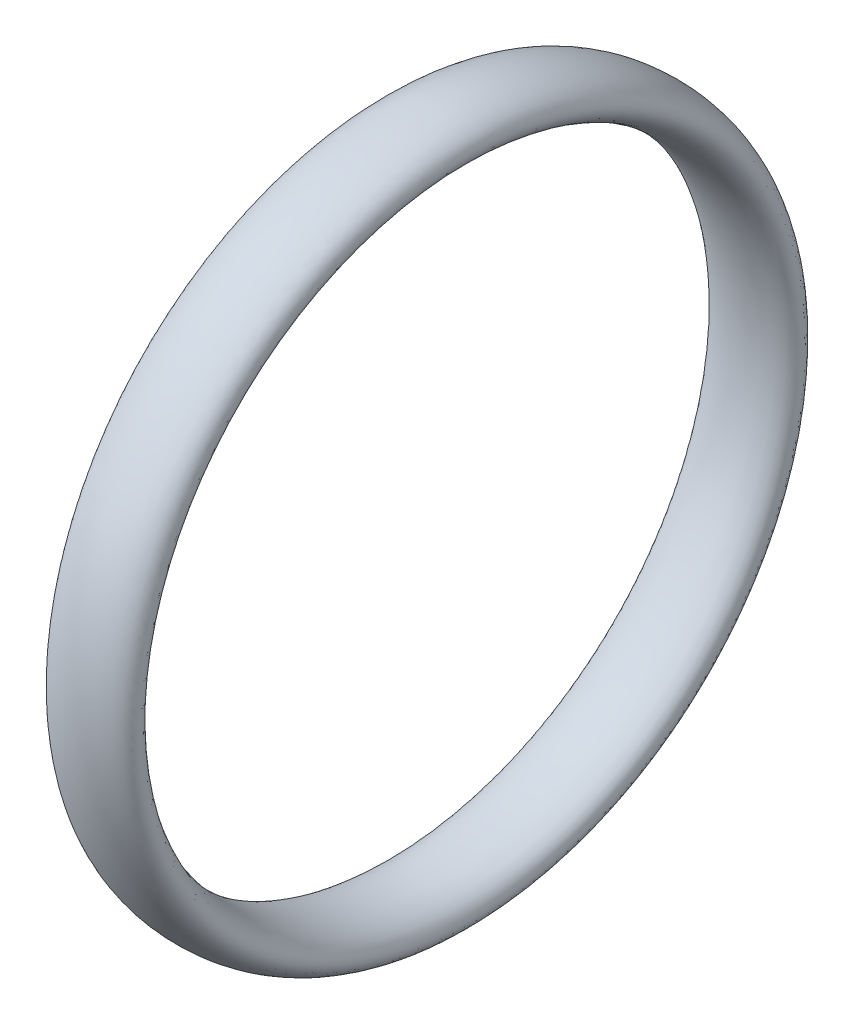
ISO-10303-21;
HEADER;
FILE_DESCRIPTION(('STEP AP214'),'2;1');
FILE_NAME('part.step','',(''),(''),'','','');
FILE_SCHEMA(('AUTOMOTIVE_DESIGN { 1 0 10303 214 1 1 1 1 }'));
ENDSEC;
DATA;
#1=APPLICATION_CONTEXT('core data for automotive mechanical design processes');
#2=APPLICATION_PROTOCOL_DEFINITION('international standard','automotive_design',2000,#1);
#3=PRODUCT_CONTEXT('',#1,'mechanical');
#4=PRODUCT('Part','Part','',(#3));
#5=PRODUCT_RELATED_PRODUCT_CATEGORY('part','',(#4));
#6=PRODUCT_DEFINITION_FORMATION('','',#4);
#7=PRODUCT_DEFINITION_CONTEXT('part definition',#1,'design');
#8=PRODUCT_DEFINITION('design','',#6,#7);
#9=PRODUCT_DEFINITION_SHAPE('','',#8);
#10=(LENGTH_UNIT() NAMED_UNIT(*) SI_UNIT(.MILLI.,.METRE.));
#11=(NAMED_UNIT(*) PLANE_ANGLE_UNIT() SI_UNIT($,.RADIAN.));
#12=(NAMED_UNIT(*) SI_UNIT($,.STERADIAN.) SOLID_ANGLE_UNIT());
#13=UNCERTAINTY_MEASURE_WITH_UNIT(LENGTH_MEASURE(1.E-05),#10,'distance_accuracy_value','');
#14=(GEOMETRIC_REPRESENTATION_CONTEXT(3) GLOBAL_UNCERTAINTY_ASSIGNED_CONTEXT((#13)) GLOBAL_UNIT_ASSIGNED_CONTEXT((#10,
#11,#12)) REPRESENTATION_CONTEXT('',''));
#15=CARTESIAN_POINT('',(0.,0.,0.));
#16=DIRECTION('',(0.,0.,1.));
#17=DIRECTION('',(1.,0.,0.));
#18=AXIS2_PLACEMENT_3D('',#15,#16,#17);
#19=CARTESIAN_POINT('',(0.,7.5,0.));
#20=DIRECTION('',(0.,0.,1.));
#21=DIRECTION('',(1.,0.,0.));
#22=AXIS2_PLACEMENT_3D('',#19,#20,#21);
#23=ELLIPSE('',#22,1.,0.5);
#24=CARTESIAN_POINT('',(0.,0.,0.));
#25=DIRECTION('',(-1.,0.,0.));
#26=AXIS1_PLACEMENT('',#24,#25);
#27=SURFACE_OF_REVOLUTION('',#23,#26);
#28=ADVANCED_FACE('F42',(),#27,.T.);
#29=CLOSED_SHELL('',(#28));
#30=MANIFOLD_SOLID_BREP('B2',#29);
#31=ADVANCED_BREP_SHAPE_REPRESENTATION('',(#18,#30),#14);
#32=SHAPE_DEFINITION_REPRESENTATION(#9,#31);
ENDSEC;
END-ISO-10303-21;
